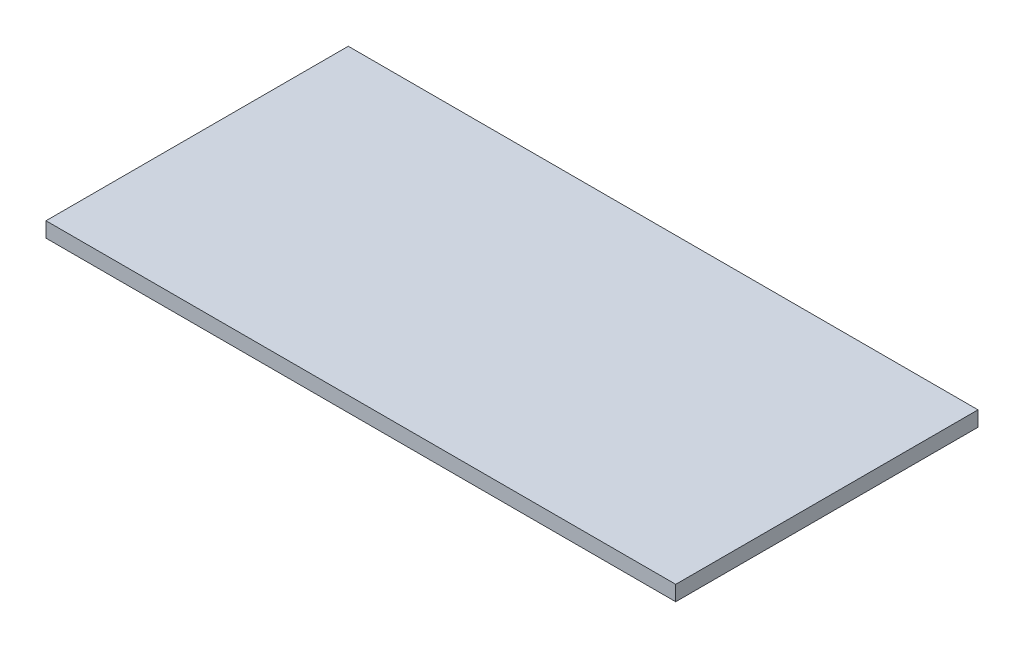
ISO-10303-21;
HEADER;
FILE_DESCRIPTION(('STEP AP214'),'2;1');
FILE_NAME('part.step','',(''),(''),'','','');
FILE_SCHEMA(('AUTOMOTIVE_DESIGN { 1 0 10303 214 1 1 1 1 }'));
ENDSEC;
DATA;
#1=APPLICATION_CONTEXT('core data for automotive mechanical design processes');
#2=APPLICATION_PROTOCOL_DEFINITION('international standard','automotive_design',2000,#1);
#3=PRODUCT_CONTEXT('',#1,'mechanical');
#4=PRODUCT('Part','Part','',(#3));
#5=PRODUCT_RELATED_PRODUCT_CATEGORY('part','',(#4));
#6=PRODUCT_DEFINITION_FORMATION('','',#4);
#7=PRODUCT_DEFINITION_CONTEXT('part definition',#1,'design');
#8=PRODUCT_DEFINITION('design','',#6,#7);
#9=PRODUCT_DEFINITION_SHAPE('','',#8);
#10=(LENGTH_UNIT() NAMED_UNIT(*) SI_UNIT(.MILLI.,.METRE.));
#11=(NAMED_UNIT(*) PLANE_ANGLE_UNIT() SI_UNIT($,.RADIAN.));
#12=(NAMED_UNIT(*) SI_UNIT($,.STERADIAN.) SOLID_ANGLE_UNIT());
#13=UNCERTAINTY_MEASURE_WITH_UNIT(LENGTH_MEASURE(1.E-05),#10,'distance_accuracy_value','');
#14=(GEOMETRIC_REPRESENTATION_CONTEXT(3) GLOBAL_UNCERTAINTY_ASSIGNED_CONTEXT((#13)) GLOBAL_UNIT_ASSIGNED_CONTEXT((#10,
#11,#12)) REPRESENTATION_CONTEXT('',''));
#15=CARTESIAN_POINT('',(0.,0.,0.));
#16=DIRECTION('',(0.,0.,1.));
#17=DIRECTION('',(1.,0.,0.));
#18=AXIS2_PLACEMENT_3D('',#15,#16,#17);
#19=CARTESIAN_POINT('',(125.,6.,-60.));
#20=DIRECTION('',(-1.,0.,0.));
#21=DIRECTION('',(0.,0.,1.));
#22=AXIS2_PLACEMENT_3D('',#19,#20,#21);
#23=PLANE('',#22);
#24=DIRECTION('',(0.,0.,-1.));
#25=VECTOR('',#24,1.);
#26=CARTESIAN_POINT('',(125.,0.,-60.));
#27=LINE('',#26,#25);
#28=CARTESIAN_POINT('',(125.,0.,60.));
#29=VERTEX_POINT('',#28);
#30=CARTESIAN_POINT('',(125.,0.,-60.));
#31=VERTEX_POINT('',#30);
#32=EDGE_CURVE('E98',#29,#31,#27,.T.);
#33=ORIENTED_EDGE('',*,*,#32,.T.);
#34=DIRECTION('',(0.,-1.,0.));
#35=VECTOR('',#34,1.);
#36=CARTESIAN_POINT('',(125.,6.,-60.));
#37=LINE('',#36,#35);
#38=CARTESIAN_POINT('',(125.,6.,-60.));
#39=VERTEX_POINT('',#38);
#40=EDGE_CURVE('E11',#39,#31,#37,.T.);
#41=ORIENTED_EDGE('',*,*,#40,.F.);
#42=DIRECTION('',(0.,0.,-1.));
#43=VECTOR('',#42,1.);
#44=CARTESIAN_POINT('',(125.,6.,-60.));
#45=LINE('',#44,#43);
#46=CARTESIAN_POINT('',(125.,6.,60.));
#47=VERTEX_POINT('',#46);
#48=EDGE_CURVE('E86',#47,#39,#45,.T.);
#49=ORIENTED_EDGE('',*,*,#48,.F.);
#50=DIRECTION('',(0.,-1.,0.));
#51=VECTOR('',#50,1.);
#52=CARTESIAN_POINT('',(125.,6.,60.));
#53=LINE('',#52,#51);
#54=EDGE_CURVE('E94',#47,#29,#53,.T.);
#55=ORIENTED_EDGE('',*,*,#54,.T.);
#56=EDGE_LOOP('',(#33,#41,#49,#55));
#57=FACE_BOUND('',#56,.T.);
#58=ADVANCED_FACE('F35',(#57),#23,.F.);
#59=CARTESIAN_POINT('',(-125.,6.,-60.));
#60=DIRECTION('',(0.,0.,1.));
#61=DIRECTION('',(1.,0.,0.));
#62=AXIS2_PLACEMENT_3D('',#59,#60,#61);
#63=PLANE('',#62);
#64=DIRECTION('',(-1.,0.,0.));
#65=VECTOR('',#64,1.);
#66=CARTESIAN_POINT('',(-125.,0.,-60.));
#67=LINE('',#66,#65);
#68=CARTESIAN_POINT('',(-125.,0.,-60.));
#69=VERTEX_POINT('',#68);
#70=EDGE_CURVE('E90',#31,#69,#67,.T.);
#71=ORIENTED_EDGE('',*,*,#70,.T.);
#72=DIRECTION('',(0.,-1.,0.));
#73=VECTOR('',#72,1.);
#74=CARTESIAN_POINT('',(-125.,6.,-60.));
#75=LINE('',#74,#73);
#76=CARTESIAN_POINT('',(-125.,6.,-60.));
#77=VERTEX_POINT('',#76);
#78=EDGE_CURVE('E43',#77,#69,#75,.T.);
#79=ORIENTED_EDGE('',*,*,#78,.F.);
#80=DIRECTION('',(-1.,0.,0.));
#81=VECTOR('',#80,1.);
#82=CARTESIAN_POINT('',(-125.,6.,-60.));
#83=LINE('',#82,#81);
#84=EDGE_CURVE('E81',#39,#77,#83,.T.);
#85=ORIENTED_EDGE('',*,*,#84,.F.);
#86=ORIENTED_EDGE('',*,*,#40,.T.);
#87=EDGE_LOOP('',(#71,#79,#85,#86));
#88=FACE_BOUND('',#87,.T.);
#89=ADVANCED_FACE('F89',(#88),#63,.F.);
#90=CARTESIAN_POINT('',(-125.,6.,-60.));
#91=DIRECTION('',(1.,0.,0.));
#92=DIRECTION('',(0.,0.,-1.));
#93=AXIS2_PLACEMENT_3D('',#90,#91,#92);
#94=PLANE('',#93);
#95=DIRECTION('',(0.,0.,1.));
#96=VECTOR('',#95,1.);
#97=CARTESIAN_POINT('',(-125.,0.,-60.));
#98=LINE('',#97,#96);
#99=CARTESIAN_POINT('',(-125.,0.,60.));
#100=VERTEX_POINT('',#99);
#101=EDGE_CURVE('E68',#69,#100,#98,.T.);
#102=ORIENTED_EDGE('',*,*,#101,.T.);
#103=DIRECTION('',(0.,-1.,0.));
#104=VECTOR('',#103,1.);
#105=CARTESIAN_POINT('',(-125.,6.,60.));
#106=LINE('',#105,#104);
#107=CARTESIAN_POINT('',(-125.,6.,60.));
#108=VERTEX_POINT('',#107);
#109=EDGE_CURVE('E91',#108,#100,#106,.T.);
#110=ORIENTED_EDGE('',*,*,#109,.F.);
#111=DIRECTION('',(0.,0.,1.));
#112=VECTOR('',#111,1.);
#113=CARTESIAN_POINT('',(-125.,6.,-60.));
#114=LINE('',#113,#112);
#115=EDGE_CURVE('E84',#77,#108,#114,.T.);
#116=ORIENTED_EDGE('',*,*,#115,.F.);
#117=ORIENTED_EDGE('',*,*,#78,.T.);
#118=EDGE_LOOP('',(#102,#110,#116,#117));
#119=FACE_BOUND('',#118,.T.);
#120=ADVANCED_FACE('F92',(#119),#94,.F.);
#121=CARTESIAN_POINT('',(-125.,6.,60.));
#122=DIRECTION('',(0.,0.,-1.));
#123=DIRECTION('',(-1.,0.,0.));
#124=AXIS2_PLACEMENT_3D('',#121,#122,#123);
#125=PLANE('',#124);
#126=DIRECTION('',(1.,0.,0.));
#127=VECTOR('',#126,1.);
#128=CARTESIAN_POINT('',(-125.,0.,60.));
#129=LINE('',#128,#127);
#130=EDGE_CURVE('E74',#100,#29,#129,.T.);
#131=ORIENTED_EDGE('',*,*,#130,.T.);
#132=ORIENTED_EDGE('',*,*,#54,.F.);
#133=DIRECTION('',(1.,0.,0.));
#134=VECTOR('',#133,1.);
#135=CARTESIAN_POINT('',(-125.,6.,60.));
#136=LINE('',#135,#134);
#137=EDGE_CURVE('E51',#108,#47,#136,.T.);
#138=ORIENTED_EDGE('',*,*,#137,.F.);
#139=ORIENTED_EDGE('',*,*,#109,.T.);
#140=EDGE_LOOP('',(#131,#132,#138,#139));
#141=FACE_BOUND('',#140,.T.);
#142=ADVANCED_FACE('F105',(#141),#125,.F.);
#143=CARTESIAN_POINT('',(0.,6.,0.));
#144=DIRECTION('',(0.,1.,0.));
#145=DIRECTION('',(0.,0.,1.));
#146=AXIS2_PLACEMENT_3D('',#143,#144,#145);
#147=PLANE('',#146);
#148=ORIENTED_EDGE('',*,*,#48,.T.);
#149=ORIENTED_EDGE('',*,*,#84,.T.);
#150=ORIENTED_EDGE('',*,*,#115,.T.);
#151=ORIENTED_EDGE('',*,*,#137,.T.);
#152=EDGE_LOOP('',(#148,#149,#150,#151));
#153=FACE_BOUND('',#152,.T.);
#154=ADVANCED_FACE('F82',(#153),#147,.T.);
#155=CARTESIAN_POINT('',(0.,0.,0.));
#156=DIRECTION('',(0.,1.,0.));
#157=DIRECTION('',(0.,0.,1.));
#158=AXIS2_PLACEMENT_3D('',#155,#156,#157);
#159=PLANE('',#158);
#160=ORIENTED_EDGE('',*,*,#32,.F.);
#161=ORIENTED_EDGE('',*,*,#130,.F.);
#162=ORIENTED_EDGE('',*,*,#101,.F.);
#163=ORIENTED_EDGE('',*,*,#70,.F.);
#164=EDGE_LOOP('',(#160,#161,#162,#163));
#165=FACE_BOUND('',#164,.T.);
#166=ADVANCED_FACE('F108',(#165),#159,.F.);
#167=CLOSED_SHELL('',(#58,#89,#120,#142,#154,#166));
#168=MANIFOLD_SOLID_BREP('B2',#167);
#169=ADVANCED_BREP_SHAPE_REPRESENTATION('',(#18,#168),#14);
#170=SHAPE_DEFINITION_REPRESENTATION(#9,#169);
ENDSEC;
END-ISO-10303-21;
